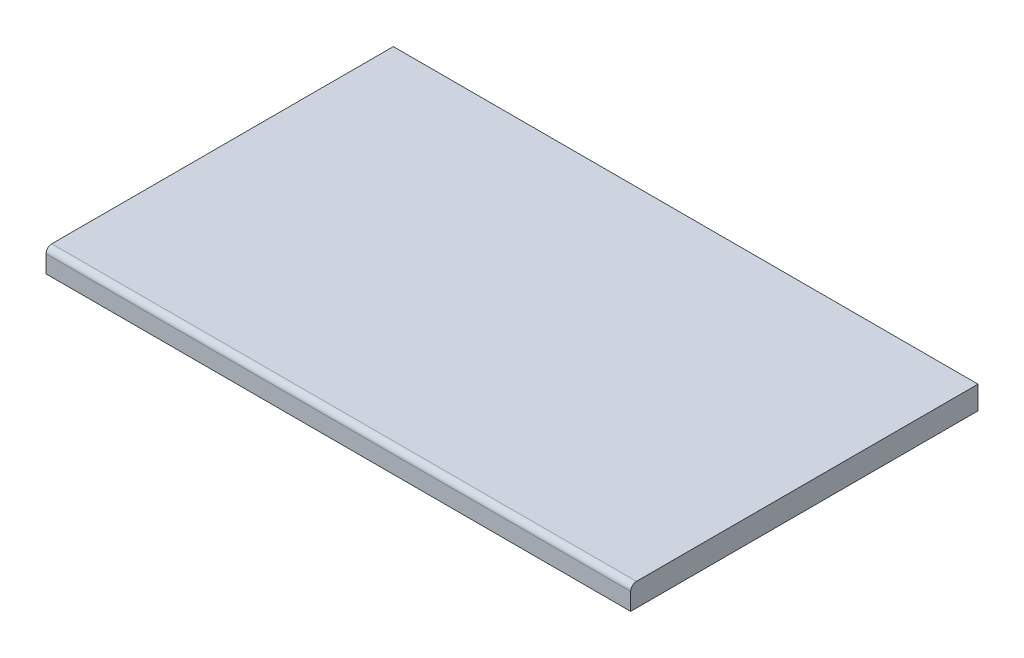
ISO-10303-21;
HEADER;
FILE_DESCRIPTION(('STEP AP214'),'2;1');
FILE_NAME('part.step','',(''),(''),'','','');
FILE_SCHEMA(('AUTOMOTIVE_DESIGN { 1 0 10303 214 1 1 1 1 }'));
ENDSEC;
DATA;
#1=APPLICATION_CONTEXT('core data for automotive mechanical design processes');
#2=APPLICATION_PROTOCOL_DEFINITION('international standard','automotive_design',2000,#1);
#3=PRODUCT_CONTEXT('',#1,'mechanical');
#4=PRODUCT('Part','Part','',(#3));
#5=PRODUCT_RELATED_PRODUCT_CATEGORY('part','',(#4));
#6=PRODUCT_DEFINITION_FORMATION('','',#4);
#7=PRODUCT_DEFINITION_CONTEXT('part definition',#1,'design');
#8=PRODUCT_DEFINITION('design','',#6,#7);
#9=PRODUCT_DEFINITION_SHAPE('','',#8);
#10=(LENGTH_UNIT() NAMED_UNIT(*) SI_UNIT(.MILLI.,.METRE.));
#11=(NAMED_UNIT(*) PLANE_ANGLE_UNIT() SI_UNIT($,.RADIAN.));
#12=(NAMED_UNIT(*) SI_UNIT($,.STERADIAN.) SOLID_ANGLE_UNIT());
#13=UNCERTAINTY_MEASURE_WITH_UNIT(LENGTH_MEASURE(1.E-05),#10,'distance_accuracy_value','');
#14=(GEOMETRIC_REPRESENTATION_CONTEXT(3) GLOBAL_UNCERTAINTY_ASSIGNED_CONTEXT((#13)) GLOBAL_UNIT_ASSIGNED_CONTEXT((#10,
#11,#12)) REPRESENTATION_CONTEXT('',''));
#15=CARTESIAN_POINT('',(0.,0.,0.));
#16=DIRECTION('',(0.,0.,1.));
#17=DIRECTION('',(1.,0.,0.));
#18=AXIS2_PLACEMENT_3D('',#15,#16,#17);
#19=CARTESIAN_POINT('',(505.,40.,-300.));
#20=DIRECTION('',(-1.,0.,0.));
#21=DIRECTION('',(0.,0.,1.));
#22=AXIS2_PLACEMENT_3D('',#19,#20,#21);
#23=PLANE('',#22);
#24=DIRECTION('',(0.,0.,-1.));
#25=VECTOR('',#24,1.);
#26=CARTESIAN_POINT('',(505.,40.,-300.));
#27=LINE('',#26,#25);
#28=CARTESIAN_POINT('',(505.,40.,290.));
#29=VERTEX_POINT('',#28);
#30=CARTESIAN_POINT('',(505.,40.,-300.));
#31=VERTEX_POINT('',#30);
#32=EDGE_CURVE('E84',#29,#31,#27,.T.);
#33=ORIENTED_EDGE('',*,*,#32,.F.);
#34=CARTESIAN_POINT('',(505.,30.,290.));
#35=DIRECTION('',(-1.,0.,0.));
#36=DIRECTION('',(0.,0.,1.));
#37=AXIS2_PLACEMENT_3D('',#34,#35,#36);
#38=CIRCLE('',#37,10.);
#39=CARTESIAN_POINT('',(505.,30.,300.));
#40=VERTEX_POINT('',#39);
#41=EDGE_CURVE('E62',#29,#40,#38,.F.);
#42=ORIENTED_EDGE('',*,*,#41,.T.);
#43=DIRECTION('',(0.,-1.,0.));
#44=VECTOR('',#43,1.);
#45=CARTESIAN_POINT('',(505.,40.,300.));
#46=LINE('',#45,#44);
#47=CARTESIAN_POINT('',(505.,0.,300.));
#48=VERTEX_POINT('',#47);
#49=EDGE_CURVE('E122',#40,#48,#46,.T.);
#50=ORIENTED_EDGE('',*,*,#49,.T.);
#51=DIRECTION('',(0.,0.,-1.));
#52=VECTOR('',#51,1.);
#53=CARTESIAN_POINT('',(505.,0.,-300.));
#54=LINE('',#53,#52);
#55=CARTESIAN_POINT('',(505.,0.,-300.));
#56=VERTEX_POINT('',#55);
#57=EDGE_CURVE('E108',#48,#56,#54,.T.);
#58=ORIENTED_EDGE('',*,*,#57,.T.);
#59=DIRECTION('',(0.,-1.,0.));
#60=VECTOR('',#59,1.);
#61=CARTESIAN_POINT('',(505.,40.,-300.));
#62=LINE('',#61,#60);
#63=EDGE_CURVE('E99',#31,#56,#62,.T.);
#64=ORIENTED_EDGE('',*,*,#63,.F.);
#65=EDGE_LOOP('',(#33,#42,#50,#58,#64));
#66=FACE_BOUND('',#65,.T.);
#67=ADVANCED_FACE('F39',(#66),#23,.F.);
#68=CARTESIAN_POINT('',(-505.,40.,-300.));
#69=DIRECTION('',(0.,0.,1.));
#70=DIRECTION('',(1.,0.,0.));
#71=AXIS2_PLACEMENT_3D('',#68,#69,#70);
#72=PLANE('',#71);
#73=DIRECTION('',(-1.,0.,0.));
#74=VECTOR('',#73,1.);
#75=CARTESIAN_POINT('',(-505.,0.,-300.));
#76=LINE('',#75,#74);
#77=CARTESIAN_POINT('',(-505.,0.,-300.));
#78=VERTEX_POINT('',#77);
#79=EDGE_CURVE('E132',#56,#78,#76,.T.);
#80=ORIENTED_EDGE('',*,*,#79,.T.);
#81=DIRECTION('',(0.,-1.,0.));
#82=VECTOR('',#81,1.);
#83=CARTESIAN_POINT('',(-505.,40.,-300.));
#84=LINE('',#83,#82);
#85=CARTESIAN_POINT('',(-505.,40.,-300.));
#86=VERTEX_POINT('',#85);
#87=EDGE_CURVE('E102',#86,#78,#84,.T.);
#88=ORIENTED_EDGE('',*,*,#87,.F.);
#89=DIRECTION('',(-1.,0.,0.));
#90=VECTOR('',#89,1.);
#91=CARTESIAN_POINT('',(-505.,40.,-300.));
#92=LINE('',#91,#90);
#93=EDGE_CURVE('E88',#31,#86,#92,.T.);
#94=ORIENTED_EDGE('',*,*,#93,.F.);
#95=ORIENTED_EDGE('',*,*,#63,.T.);
#96=EDGE_LOOP('',(#80,#88,#94,#95));
#97=FACE_BOUND('',#96,.T.);
#98=ADVANCED_FACE('F98',(#97),#72,.F.);
#99=CARTESIAN_POINT('',(-505.,40.,-300.));
#100=DIRECTION('',(1.,0.,0.));
#101=DIRECTION('',(0.,0.,-1.));
#102=AXIS2_PLACEMENT_3D('',#99,#100,#101);
#103=PLANE('',#102);
#104=DIRECTION('',(0.,-1.,0.));
#105=VECTOR('',#104,1.);
#106=CARTESIAN_POINT('',(-505.,40.,300.));
#107=LINE('',#106,#105);
#108=CARTESIAN_POINT('',(-505.,30.,300.));
#109=VERTEX_POINT('',#108);
#110=CARTESIAN_POINT('',(-505.,0.,300.));
#111=VERTEX_POINT('',#110);
#112=EDGE_CURVE('E114',#109,#111,#107,.T.);
#113=ORIENTED_EDGE('',*,*,#112,.F.);
#114=CARTESIAN_POINT('',(-505.,30.,290.));
#115=DIRECTION('',(1.,0.,0.));
#116=DIRECTION('',(0.,0.,-1.));
#117=AXIS2_PLACEMENT_3D('',#114,#115,#116);
#118=CIRCLE('',#117,10.);
#119=CARTESIAN_POINT('',(-505.,40.,290.));
#120=VERTEX_POINT('',#119);
#121=EDGE_CURVE('E11',#109,#120,#118,.F.);
#122=ORIENTED_EDGE('',*,*,#121,.T.);
#123=DIRECTION('',(0.,0.,1.));
#124=VECTOR('',#123,1.);
#125=CARTESIAN_POINT('',(-505.,40.,-300.));
#126=LINE('',#125,#124);
#127=EDGE_CURVE('E105',#86,#120,#126,.T.);
#128=ORIENTED_EDGE('',*,*,#127,.F.);
#129=ORIENTED_EDGE('',*,*,#87,.T.);
#130=DIRECTION('',(0.,0.,1.));
#131=VECTOR('',#130,1.);
#132=CARTESIAN_POINT('',(-505.,0.,-300.));
#133=LINE('',#132,#131);
#134=EDGE_CURVE('E128',#78,#111,#133,.T.);
#135=ORIENTED_EDGE('',*,*,#134,.T.);
#136=EDGE_LOOP('',(#113,#122,#128,#129,#135));
#137=FACE_BOUND('',#136,.T.);
#138=ADVANCED_FACE('F141',(#137),#103,.F.);
#139=CARTESIAN_POINT('',(-505.,40.,300.));
#140=DIRECTION('',(0.,0.,-1.));
#141=DIRECTION('',(-1.,0.,0.));
#142=AXIS2_PLACEMENT_3D('',#139,#140,#141);
#143=PLANE('',#142);
#144=ORIENTED_EDGE('',*,*,#49,.F.);
#145=DIRECTION('',(1.,0.,0.));
#146=VECTOR('',#145,1.);
#147=CARTESIAN_POINT('',(-505.,30.,300.));
#148=LINE('',#147,#146);
#149=EDGE_CURVE('E48',#40,#109,#148,.F.);
#150=ORIENTED_EDGE('',*,*,#149,.T.);
#151=ORIENTED_EDGE('',*,*,#112,.T.);
#152=DIRECTION('',(1.,0.,0.));
#153=VECTOR('',#152,1.);
#154=CARTESIAN_POINT('',(-505.,0.,300.));
#155=LINE('',#154,#153);
#156=EDGE_CURVE('E94',#111,#48,#155,.T.);
#157=ORIENTED_EDGE('',*,*,#156,.T.);
#158=EDGE_LOOP('',(#144,#150,#151,#157));
#159=FACE_BOUND('',#158,.T.);
#160=ADVANCED_FACE('F144',(#159),#143,.F.);
#161=CARTESIAN_POINT('',(0.,40.,0.));
#162=DIRECTION('',(0.,1.,0.));
#163=DIRECTION('',(0.,0.,1.));
#164=AXIS2_PLACEMENT_3D('',#161,#162,#163);
#165=PLANE('',#164);
#166=ORIENTED_EDGE('',*,*,#127,.T.);
#167=DIRECTION('',(1.,0.,0.));
#168=VECTOR('',#167,1.);
#169=CARTESIAN_POINT('',(505.,40.,290.));
#170=LINE('',#169,#168);
#171=EDGE_CURVE('E91',#120,#29,#170,.T.);
#172=ORIENTED_EDGE('',*,*,#171,.T.);
#173=ORIENTED_EDGE('',*,*,#32,.T.);
#174=ORIENTED_EDGE('',*,*,#93,.T.);
#175=EDGE_LOOP('',(#166,#172,#173,#174));
#176=FACE_BOUND('',#175,.T.);
#177=ADVANCED_FACE('F87',(#176),#165,.T.);
#178=CARTESIAN_POINT('',(0.,0.,0.));
#179=DIRECTION('',(0.,1.,0.));
#180=DIRECTION('',(0.,0.,1.));
#181=AXIS2_PLACEMENT_3D('',#178,#179,#180);
#182=PLANE('',#181);
#183=ORIENTED_EDGE('',*,*,#57,.F.);
#184=ORIENTED_EDGE('',*,*,#156,.F.);
#185=ORIENTED_EDGE('',*,*,#134,.F.);
#186=ORIENTED_EDGE('',*,*,#79,.F.);
#187=EDGE_LOOP('',(#183,#184,#185,#186));
#188=FACE_BOUND('',#187,.T.);
#189=ADVANCED_FACE('F146',(#188),#182,.F.);
#190=CARTESIAN_POINT('',(0.,30.,290.));
#191=DIRECTION('',(-1.,0.,0.));
#192=DIRECTION('',(0.,0.,1.));
#193=AXIS2_PLACEMENT_3D('',#190,#191,#192);
#194=CYLINDRICAL_SURFACE('',#193,10.);
#195=ORIENTED_EDGE('',*,*,#121,.F.);
#196=ORIENTED_EDGE('',*,*,#149,.F.);
#197=ORIENTED_EDGE('',*,*,#41,.F.);
#198=ORIENTED_EDGE('',*,*,#171,.F.);
#199=EDGE_LOOP('',(#195,#196,#197,#198));
#200=FACE_BOUND('',#199,.T.);
#201=ADVANCED_FACE('F41',(#200),#194,.T.);
#202=CLOSED_SHELL('',(#67,#98,#138,#160,#177,#189,#201));
#203=MANIFOLD_SOLID_BREP('B2',#202);
#204=ADVANCED_BREP_SHAPE_REPRESENTATION('',(#18,#203),#14);
#205=SHAPE_DEFINITION_REPRESENTATION(#9,#204);
ENDSEC;
END-ISO-10303-21;
